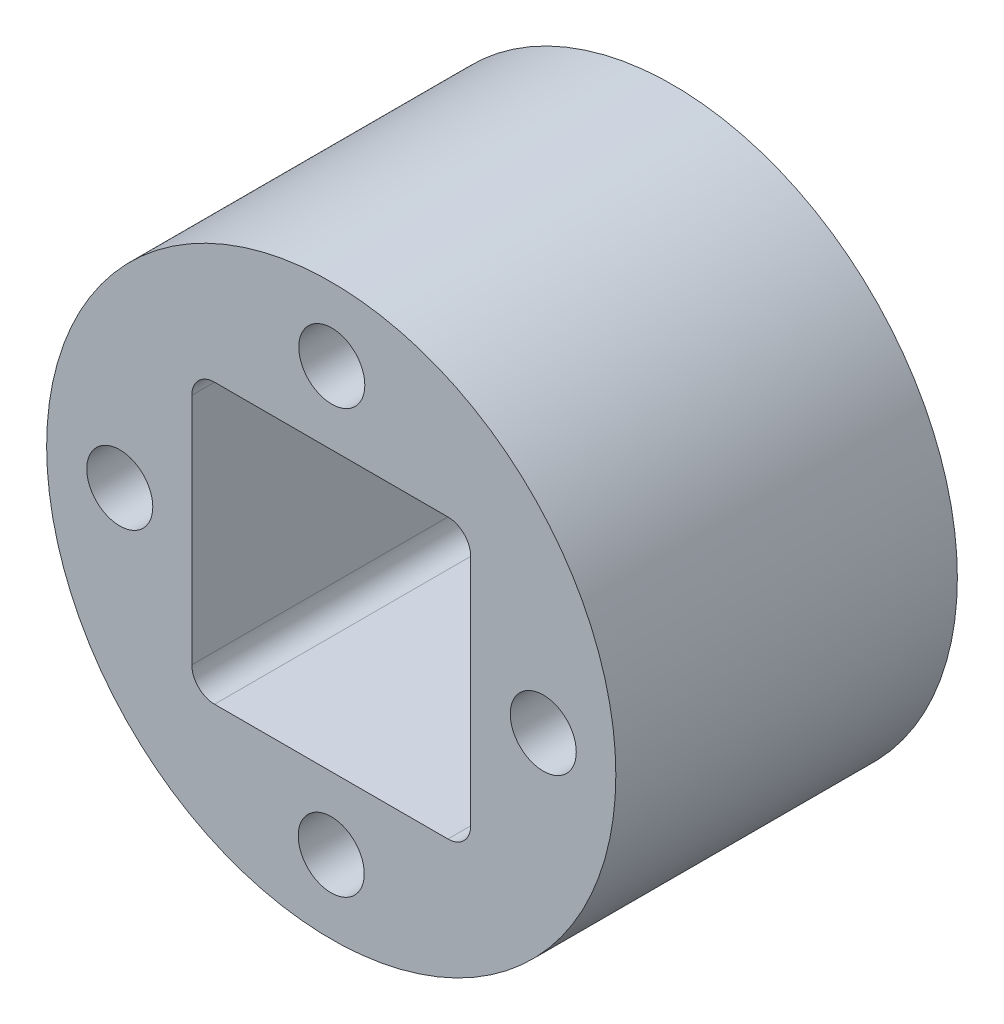
ISO-10303-21;
HEADER;
FILE_DESCRIPTION(('STEP AP214'),'2;1');
FILE_NAME('part.step','',(''),(''),'','','');
FILE_SCHEMA(('AUTOMOTIVE_DESIGN { 1 0 10303 214 1 1 1 1 }'));
ENDSEC;
DATA;
#1=APPLICATION_CONTEXT('core data for automotive mechanical design processes');
#2=APPLICATION_PROTOCOL_DEFINITION('international standard','automotive_design',2000,#1);
#3=PRODUCT_CONTEXT('',#1,'mechanical');
#4=PRODUCT('Part','Part','',(#3));
#5=PRODUCT_RELATED_PRODUCT_CATEGORY('part','',(#4));
#6=PRODUCT_DEFINITION_FORMATION('','',#4);
#7=PRODUCT_DEFINITION_CONTEXT('part definition',#1,'design');
#8=PRODUCT_DEFINITION('design','',#6,#7);
#9=PRODUCT_DEFINITION_SHAPE('','',#8);
#10=(LENGTH_UNIT() NAMED_UNIT(*) SI_UNIT(.MILLI.,.METRE.));
#11=(NAMED_UNIT(*) PLANE_ANGLE_UNIT() SI_UNIT($,.RADIAN.));
#12=(NAMED_UNIT(*) SI_UNIT($,.STERADIAN.) SOLID_ANGLE_UNIT());
#13=UNCERTAINTY_MEASURE_WITH_UNIT(LENGTH_MEASURE(1.E-05),#10,'distance_accuracy_value','');
#14=(GEOMETRIC_REPRESENTATION_CONTEXT(3) GLOBAL_UNCERTAINTY_ASSIGNED_CONTEXT((#13)) GLOBAL_UNIT_ASSIGNED_CONTEXT((#10,
#11,#12)) REPRESENTATION_CONTEXT('',''));
#15=CARTESIAN_POINT('',(0.,0.,0.));
#16=DIRECTION('',(0.,0.,1.));
#17=DIRECTION('',(1.,0.,0.));
#18=AXIS2_PLACEMENT_3D('',#15,#16,#17);
#19=CARTESIAN_POINT('',(0.,0.,7.5));
#20=DIRECTION('',(0.,0.,-1.));
#21=DIRECTION('',(-1.,0.,0.));
#22=AXIS2_PLACEMENT_3D('',#19,#20,#21);
#23=CYLINDRICAL_SURFACE('',#22,12.5);
#24=CARTESIAN_POINT('',(0.,0.,7.5));
#25=DIRECTION('',(0.,0.,1.));
#26=DIRECTION('',(1.,0.,0.));
#27=AXIS2_PLACEMENT_3D('',#24,#25,#26);
#28=CIRCLE('',#27,12.5);
#29=CARTESIAN_POINT('',(12.5,0.,7.5));
#30=VERTEX_POINT('',#29);
#31=EDGE_CURVE('E112',#30,#30,#28,.T.);
#32=ORIENTED_EDGE('',*,*,#31,.F.);
#33=EDGE_LOOP('',(#32));
#34=FACE_BOUND('',#33,.T.);
#35=CARTESIAN_POINT('',(0.,0.,-7.5));
#36=DIRECTION('',(0.,0.,1.));
#37=DIRECTION('',(1.,0.,0.));
#38=AXIS2_PLACEMENT_3D('',#35,#36,#37);
#39=CIRCLE('',#38,12.5);
#40=CARTESIAN_POINT('',(12.5,0.,-7.5));
#41=VERTEX_POINT('',#40);
#42=EDGE_CURVE('E151',#41,#41,#39,.T.);
#43=ORIENTED_EDGE('',*,*,#42,.T.);
#44=EDGE_LOOP('',(#43));
#45=FACE_BOUND('',#44,.T.);
#46=ADVANCED_FACE('F37',(#34,#45),#23,.T.);
#47=CARTESIAN_POINT('',(0.,0.,7.5));
#48=DIRECTION('',(0.,0.,1.));
#49=DIRECTION('',(1.,0.,0.));
#50=AXIS2_PLACEMENT_3D('',#47,#48,#49);
#51=PLANE('',#50);
#52=CARTESIAN_POINT('',(9.3125,0.,7.5));
#53=DIRECTION('',(0.,0.,1.));
#54=DIRECTION('',(1.,0.,0.));
#55=AXIS2_PLACEMENT_3D('',#52,#53,#54);
#56=CIRCLE('',#55,1.45);
#57=CARTESIAN_POINT('',(10.7625,0.,7.5));
#58=VERTEX_POINT('',#57);
#59=EDGE_CURVE('E202',#58,#58,#56,.T.);
#60=ORIENTED_EDGE('',*,*,#59,.F.);
#61=EDGE_LOOP('',(#60));
#62=FACE_BOUND('',#61,.T.);
#63=CARTESIAN_POINT('',(0.,-9.2875,7.5));
#64=DIRECTION('',(0.,0.,1.));
#65=DIRECTION('',(1.,0.,0.));
#66=AXIS2_PLACEMENT_3D('',#63,#64,#65);
#67=CIRCLE('',#66,1.45);
#68=CARTESIAN_POINT('',(1.45,-9.2875,7.5));
#69=VERTEX_POINT('',#68);
#70=EDGE_CURVE('E196',#69,#69,#67,.T.);
#71=ORIENTED_EDGE('',*,*,#70,.F.);
#72=EDGE_LOOP('',(#71));
#73=FACE_BOUND('',#72,.T.);
#74=CARTESIAN_POINT('',(-9.2875,0.0249999999999996,7.5));
#75=DIRECTION('',(0.,0.,1.));
#76=DIRECTION('',(1.,0.,0.));
#77=AXIS2_PLACEMENT_3D('',#74,#75,#76);
#78=CIRCLE('',#77,1.45);
#79=CARTESIAN_POINT('',(-7.8375,0.0249999999999996,7.5));
#80=VERTEX_POINT('',#79);
#81=EDGE_CURVE('E190',#80,#80,#78,.T.);
#82=ORIENTED_EDGE('',*,*,#81,.F.);
#83=EDGE_LOOP('',(#82));
#84=FACE_BOUND('',#83,.T.);
#85=CARTESIAN_POINT('',(0.0250000000000016,9.3125,7.5));
#86=DIRECTION('',(0.,0.,1.));
#87=DIRECTION('',(1.,0.,0.));
#88=AXIS2_PLACEMENT_3D('',#85,#86,#87);
#89=CIRCLE('',#88,1.45);
#90=CARTESIAN_POINT('',(1.475,9.3125,7.5));
#91=VERTEX_POINT('',#90);
#92=EDGE_CURVE('E184',#91,#91,#89,.T.);
#93=ORIENTED_EDGE('',*,*,#92,.F.);
#94=EDGE_LOOP('',(#93));
#95=FACE_BOUND('',#94,.T.);
#96=DIRECTION('',(0.,1.,0.));
#97=VECTOR('',#96,1.);
#98=CARTESIAN_POINT('',(6.125,6.125,7.5));
#99=LINE('',#98,#97);
#100=CARTESIAN_POINT('',(6.125,-5.125,7.5));
#101=VERTEX_POINT('',#100);
#102=CARTESIAN_POINT('',(6.125,5.125,7.5));
#103=VERTEX_POINT('',#102);
#104=EDGE_CURVE('E172',#101,#103,#99,.T.);
#105=ORIENTED_EDGE('',*,*,#104,.F.);
#106=CARTESIAN_POINT('',(5.125,-5.125,7.5));
#107=DIRECTION('',(0.,0.,1.));
#108=DIRECTION('',(1.,0.,0.));
#109=AXIS2_PLACEMENT_3D('',#106,#107,#108);
#110=CIRCLE('',#109,1.);
#111=CARTESIAN_POINT('',(5.125,-6.125,7.5));
#112=VERTEX_POINT('',#111);
#113=EDGE_CURVE('E52',#101,#112,#110,.F.);
#114=ORIENTED_EDGE('',*,*,#113,.T.);
#115=DIRECTION('',(1.,0.,0.));
#116=VECTOR('',#115,1.);
#117=CARTESIAN_POINT('',(-6.125,-6.125,7.5));
#118=LINE('',#117,#116);
#119=CARTESIAN_POINT('',(-5.125,-6.125,7.5));
#120=VERTEX_POINT('',#119);
#121=EDGE_CURVE('E146',#120,#112,#118,.T.);
#122=ORIENTED_EDGE('',*,*,#121,.F.);
#123=CARTESIAN_POINT('',(-5.125,-5.125,7.5));
#124=DIRECTION('',(0.,0.,1.));
#125=DIRECTION('',(1.,0.,0.));
#126=AXIS2_PLACEMENT_3D('',#123,#124,#125);
#127=CIRCLE('',#126,1.);
#128=CARTESIAN_POINT('',(-6.125,-5.125,7.5));
#129=VERTEX_POINT('',#128);
#130=EDGE_CURVE('E45',#120,#129,#127,.F.);
#131=ORIENTED_EDGE('',*,*,#130,.T.);
#132=DIRECTION('',(0.,-1.,0.));
#133=VECTOR('',#132,1.);
#134=CARTESIAN_POINT('',(-6.125,6.125,7.5));
#135=LINE('',#134,#133);
#136=CARTESIAN_POINT('',(-6.125,5.125,7.5));
#137=VERTEX_POINT('',#136);
#138=EDGE_CURVE('E109',#137,#129,#135,.T.);
#139=ORIENTED_EDGE('',*,*,#138,.F.);
#140=CARTESIAN_POINT('',(-5.125,5.125,7.5));
#141=DIRECTION('',(0.,0.,1.));
#142=DIRECTION('',(1.,0.,0.));
#143=AXIS2_PLACEMENT_3D('',#140,#141,#142);
#144=CIRCLE('',#143,1.);
#145=CARTESIAN_POINT('',(-5.125,6.125,7.5));
#146=VERTEX_POINT('',#145);
#147=EDGE_CURVE('E130',#137,#146,#144,.F.);
#148=ORIENTED_EDGE('',*,*,#147,.T.);
#149=DIRECTION('',(-1.,0.,0.));
#150=VECTOR('',#149,1.);
#151=CARTESIAN_POINT('',(-6.125,6.125,7.5));
#152=LINE('',#151,#150);
#153=CARTESIAN_POINT('',(5.125,6.125,7.5));
#154=VERTEX_POINT('',#153);
#155=EDGE_CURVE('E153',#154,#146,#152,.T.);
#156=ORIENTED_EDGE('',*,*,#155,.F.);
#157=CARTESIAN_POINT('',(5.125,5.125,7.5));
#158=DIRECTION('',(0.,0.,1.));
#159=DIRECTION('',(1.,0.,0.));
#160=AXIS2_PLACEMENT_3D('',#157,#158,#159);
#161=CIRCLE('',#160,1.);
#162=EDGE_CURVE('E138',#154,#103,#161,.F.);
#163=ORIENTED_EDGE('',*,*,#162,.T.);
#164=EDGE_LOOP('',(#105,#114,#122,#131,#139,#148,#156,#163));
#165=FACE_BOUND('',#164,.T.);
#166=ORIENTED_EDGE('',*,*,#31,.T.);
#167=EDGE_LOOP('',(#166));
#168=FACE_BOUND('',#167,.T.);
#169=ADVANCED_FACE('F144',(#62,#73,#84,#95,#165,#168),#51,.T.);
#170=CARTESIAN_POINT('',(0.,0.,-7.5));
#171=DIRECTION('',(0.,0.,1.));
#172=DIRECTION('',(1.,0.,0.));
#173=AXIS2_PLACEMENT_3D('',#170,#171,#172);
#174=PLANE('',#173);
#175=DIRECTION('',(-1.,0.,0.));
#176=VECTOR('',#175,1.);
#177=CARTESIAN_POINT('',(-6.125,-6.125,-7.5));
#178=LINE('',#177,#176);
#179=CARTESIAN_POINT('',(5.125,-6.125,-7.5));
#180=VERTEX_POINT('',#179);
#181=CARTESIAN_POINT('',(-5.125,-6.125,-7.5));
#182=VERTEX_POINT('',#181);
#183=EDGE_CURVE('E122',#180,#182,#178,.T.);
#184=ORIENTED_EDGE('',*,*,#183,.F.);
#185=CARTESIAN_POINT('',(5.125,-5.125,-7.5));
#186=DIRECTION('',(0.,0.,1.));
#187=DIRECTION('',(1.,0.,0.));
#188=AXIS2_PLACEMENT_3D('',#185,#186,#187);
#189=CIRCLE('',#188,1.);
#190=CARTESIAN_POINT('',(6.125,-5.125,-7.5));
#191=VERTEX_POINT('',#190);
#192=EDGE_CURVE('E143',#180,#191,#189,.T.);
#193=ORIENTED_EDGE('',*,*,#192,.T.);
#194=DIRECTION('',(0.,-1.,0.));
#195=VECTOR('',#194,1.);
#196=CARTESIAN_POINT('',(6.125,6.125,-7.5));
#197=LINE('',#196,#195);
#198=CARTESIAN_POINT('',(6.125,5.125,-7.5));
#199=VERTEX_POINT('',#198);
#200=EDGE_CURVE('E175',#199,#191,#197,.T.);
#201=ORIENTED_EDGE('',*,*,#200,.F.);
#202=CARTESIAN_POINT('',(5.125,5.125,-7.5));
#203=DIRECTION('',(0.,0.,1.));
#204=DIRECTION('',(1.,0.,0.));
#205=AXIS2_PLACEMENT_3D('',#202,#203,#204);
#206=CIRCLE('',#205,1.);
#207=CARTESIAN_POINT('',(5.125,6.125,-7.5));
#208=VERTEX_POINT('',#207);
#209=EDGE_CURVE('E140',#199,#208,#206,.T.);
#210=ORIENTED_EDGE('',*,*,#209,.T.);
#211=DIRECTION('',(1.,0.,0.));
#212=VECTOR('',#211,1.);
#213=CARTESIAN_POINT('',(-6.125,6.125,-7.5));
#214=LINE('',#213,#212);
#215=CARTESIAN_POINT('',(-5.125,6.125,-7.5));
#216=VERTEX_POINT('',#215);
#217=EDGE_CURVE('E148',#216,#208,#214,.T.);
#218=ORIENTED_EDGE('',*,*,#217,.F.);
#219=CARTESIAN_POINT('',(-5.125,5.125,-7.5));
#220=DIRECTION('',(0.,0.,1.));
#221=DIRECTION('',(1.,0.,0.));
#222=AXIS2_PLACEMENT_3D('',#219,#220,#221);
#223=CIRCLE('',#222,1.);
#224=CARTESIAN_POINT('',(-6.125,5.125,-7.5));
#225=VERTEX_POINT('',#224);
#226=EDGE_CURVE('E121',#216,#225,#223,.T.);
#227=ORIENTED_EDGE('',*,*,#226,.T.);
#228=DIRECTION('',(0.,1.,0.));
#229=VECTOR('',#228,1.);
#230=CARTESIAN_POINT('',(-6.125,6.125,-7.5));
#231=LINE('',#230,#229);
#232=CARTESIAN_POINT('',(-6.125,-5.125,-7.5));
#233=VERTEX_POINT('',#232);
#234=EDGE_CURVE('E106',#233,#225,#231,.T.);
#235=ORIENTED_EDGE('',*,*,#234,.F.);
#236=CARTESIAN_POINT('',(-5.125,-5.125,-7.5));
#237=DIRECTION('',(0.,0.,1.));
#238=DIRECTION('',(1.,0.,0.));
#239=AXIS2_PLACEMENT_3D('',#236,#237,#238);
#240=CIRCLE('',#239,1.);
#241=EDGE_CURVE('E11',#233,#182,#240,.T.);
#242=ORIENTED_EDGE('',*,*,#241,.T.);
#243=EDGE_LOOP('',(#184,#193,#201,#210,#218,#227,#235,#242));
#244=FACE_BOUND('',#243,.T.);
#245=ORIENTED_EDGE('',*,*,#42,.F.);
#246=EDGE_LOOP('',(#245));
#247=FACE_BOUND('',#246,.T.);
#248=ADVANCED_FACE('F116',(#244,#247),#174,.F.);
#249=CARTESIAN_POINT('',(6.125,6.125,-7.501));
#250=DIRECTION('',(1.,0.,0.));
#251=DIRECTION('',(0.,1.,0.));
#252=AXIS2_PLACEMENT_3D('',#249,#250,#251);
#253=PLANE('',#252);
#254=ORIENTED_EDGE('',*,*,#104,.T.);
#255=DIRECTION('',(0.,0.,1.));
#256=VECTOR('',#255,1.);
#257=CARTESIAN_POINT('',(6.125,5.125,-7.5));
#258=LINE('',#257,#256);
#259=EDGE_CURVE('E128',#103,#199,#258,.F.);
#260=ORIENTED_EDGE('',*,*,#259,.T.);
#261=ORIENTED_EDGE('',*,*,#200,.T.);
#262=DIRECTION('',(0.,0.,1.));
#263=VECTOR('',#262,1.);
#264=CARTESIAN_POINT('',(6.125,-5.125,7.5));
#265=LINE('',#264,#263);
#266=EDGE_CURVE('E132',#191,#101,#265,.T.);
#267=ORIENTED_EDGE('',*,*,#266,.T.);
#268=EDGE_LOOP('',(#254,#260,#261,#267));
#269=FACE_BOUND('',#268,.T.);
#270=ADVANCED_FACE('F171',(#269),#253,.F.);
#271=CARTESIAN_POINT('',(-6.125,-6.125,-7.501));
#272=DIRECTION('',(0.,-1.,0.));
#273=DIRECTION('',(0.,0.,-1.));
#274=AXIS2_PLACEMENT_3D('',#271,#272,#273);
#275=PLANE('',#274);
#276=ORIENTED_EDGE('',*,*,#121,.T.);
#277=DIRECTION('',(0.,0.,1.));
#278=VECTOR('',#277,1.);
#279=CARTESIAN_POINT('',(5.125,-6.125,-7.5));
#280=LINE('',#279,#278);
#281=EDGE_CURVE('E127',#112,#180,#280,.F.);
#282=ORIENTED_EDGE('',*,*,#281,.T.);
#283=ORIENTED_EDGE('',*,*,#183,.T.);
#284=DIRECTION('',(0.,0.,1.));
#285=VECTOR('',#284,1.);
#286=CARTESIAN_POINT('',(-5.125,-6.125,7.5));
#287=LINE('',#286,#285);
#288=EDGE_CURVE('E125',#182,#120,#287,.T.);
#289=ORIENTED_EDGE('',*,*,#288,.T.);
#290=EDGE_LOOP('',(#276,#282,#283,#289));
#291=FACE_BOUND('',#290,.T.);
#292=ADVANCED_FACE('F265',(#291),#275,.F.);
#293=CARTESIAN_POINT('',(-6.125,6.125,-7.501));
#294=DIRECTION('',(-1.,0.,0.));
#295=DIRECTION('',(0.,-1.,0.));
#296=AXIS2_PLACEMENT_3D('',#293,#294,#295);
#297=PLANE('',#296);
#298=ORIENTED_EDGE('',*,*,#234,.T.);
#299=DIRECTION('',(0.,0.,1.));
#300=VECTOR('',#299,1.);
#301=CARTESIAN_POINT('',(-6.125,5.125,7.5));
#302=LINE('',#301,#300);
#303=EDGE_CURVE('E111',#225,#137,#302,.T.);
#304=ORIENTED_EDGE('',*,*,#303,.T.);
#305=ORIENTED_EDGE('',*,*,#138,.T.);
#306=DIRECTION('',(0.,0.,1.));
#307=VECTOR('',#306,1.);
#308=CARTESIAN_POINT('',(-6.125,-5.125,-7.5));
#309=LINE('',#308,#307);
#310=EDGE_CURVE('E102',#129,#233,#309,.F.);
#311=ORIENTED_EDGE('',*,*,#310,.T.);
#312=EDGE_LOOP('',(#298,#304,#305,#311));
#313=FACE_BOUND('',#312,.T.);
#314=ADVANCED_FACE('F104',(#313),#297,.F.);
#315=CARTESIAN_POINT('',(-6.125,6.125,-7.501));
#316=DIRECTION('',(0.,1.,0.));
#317=DIRECTION('',(0.,0.,1.));
#318=AXIS2_PLACEMENT_3D('',#315,#316,#317);
#319=PLANE('',#318);
#320=ORIENTED_EDGE('',*,*,#155,.T.);
#321=DIRECTION('',(0.,0.,1.));
#322=VECTOR('',#321,1.);
#323=CARTESIAN_POINT('',(-5.125,6.125,-7.5));
#324=LINE('',#323,#322);
#325=EDGE_CURVE('E165',#146,#216,#324,.F.);
#326=ORIENTED_EDGE('',*,*,#325,.T.);
#327=ORIENTED_EDGE('',*,*,#217,.T.);
#328=DIRECTION('',(0.,0.,1.));
#329=VECTOR('',#328,1.);
#330=CARTESIAN_POINT('',(5.125,6.125,7.5));
#331=LINE('',#330,#329);
#332=EDGE_CURVE('E162',#208,#154,#331,.T.);
#333=ORIENTED_EDGE('',*,*,#332,.T.);
#334=EDGE_LOOP('',(#320,#326,#327,#333));
#335=FACE_BOUND('',#334,.T.);
#336=ADVANCED_FACE('F229',(#335),#319,.F.);
#337=CARTESIAN_POINT('',(0.0250000000000016,9.3125,-2.5));
#338=DIRECTION('',(0.,0.,1.));
#339=DIRECTION('',(1.,0.,0.));
#340=AXIS2_PLACEMENT_3D('',#337,#338,#339);
#341=CYLINDRICAL_SURFACE('',#340,1.45);
#342=CARTESIAN_POINT('',(0.0250000000000016,9.3125,-2.5));
#343=DIRECTION('',(0.,0.,1.));
#344=DIRECTION('',(1.,0.,0.));
#345=AXIS2_PLACEMENT_3D('',#342,#343,#344);
#346=CIRCLE('',#345,1.45);
#347=CARTESIAN_POINT('',(1.475,9.3125,-2.5));
#348=VERTEX_POINT('',#347);
#349=EDGE_CURVE('E187',#348,#348,#346,.T.);
#350=ORIENTED_EDGE('',*,*,#349,.F.);
#351=EDGE_LOOP('',(#350));
#352=FACE_BOUND('',#351,.T.);
#353=ORIENTED_EDGE('',*,*,#92,.T.);
#354=EDGE_LOOP('',(#353));
#355=FACE_BOUND('',#354,.T.);
#356=ADVANCED_FACE('F226',(#352,#355),#341,.F.);
#357=CARTESIAN_POINT('',(0.0250000000000016,9.3125,-2.5));
#358=DIRECTION('',(0.,0.,1.));
#359=DIRECTION('',(1.,0.,0.));
#360=AXIS2_PLACEMENT_3D('',#357,#358,#359);
#361=PLANE('',#360);
#362=ORIENTED_EDGE('',*,*,#349,.T.);
#363=EDGE_LOOP('',(#362));
#364=FACE_BOUND('',#363,.T.);
#365=ADVANCED_FACE('F228',(#364),#361,.T.);
#366=CARTESIAN_POINT('',(-9.2875,0.0249999999999996,-2.5));
#367=DIRECTION('',(0.,0.,1.));
#368=DIRECTION('',(1.,0.,0.));
#369=AXIS2_PLACEMENT_3D('',#366,#367,#368);
#370=CYLINDRICAL_SURFACE('',#369,1.45);
#371=CARTESIAN_POINT('',(-9.2875,0.0249999999999996,-2.5));
#372=DIRECTION('',(0.,0.,1.));
#373=DIRECTION('',(1.,0.,0.));
#374=AXIS2_PLACEMENT_3D('',#371,#372,#373);
#375=CIRCLE('',#374,1.45);
#376=CARTESIAN_POINT('',(-7.8375,0.0249999999999996,-2.5));
#377=VERTEX_POINT('',#376);
#378=EDGE_CURVE('E193',#377,#377,#375,.T.);
#379=ORIENTED_EDGE('',*,*,#378,.F.);
#380=EDGE_LOOP('',(#379));
#381=FACE_BOUND('',#380,.T.);
#382=ORIENTED_EDGE('',*,*,#81,.T.);
#383=EDGE_LOOP('',(#382));
#384=FACE_BOUND('',#383,.T.);
#385=ADVANCED_FACE('F236',(#381,#384),#370,.F.);
#386=CARTESIAN_POINT('',(-9.2875,0.0249999999999996,-2.5));
#387=DIRECTION('',(0.,0.,1.));
#388=DIRECTION('',(1.,0.,0.));
#389=AXIS2_PLACEMENT_3D('',#386,#387,#388);
#390=PLANE('',#389);
#391=ORIENTED_EDGE('',*,*,#378,.T.);
#392=EDGE_LOOP('',(#391));
#393=FACE_BOUND('',#392,.T.);
#394=ADVANCED_FACE('F317',(#393),#390,.T.);
#395=CARTESIAN_POINT('',(0.,-9.2875,-2.5));
#396=DIRECTION('',(0.,0.,1.));
#397=DIRECTION('',(1.,0.,0.));
#398=AXIS2_PLACEMENT_3D('',#395,#396,#397);
#399=CYLINDRICAL_SURFACE('',#398,1.45);
#400=CARTESIAN_POINT('',(0.,-9.2875,-2.5));
#401=DIRECTION('',(0.,0.,1.));
#402=DIRECTION('',(1.,0.,0.));
#403=AXIS2_PLACEMENT_3D('',#400,#401,#402);
#404=CIRCLE('',#403,1.45);
#405=CARTESIAN_POINT('',(1.45,-9.2875,-2.5));
#406=VERTEX_POINT('',#405);
#407=EDGE_CURVE('E199',#406,#406,#404,.T.);
#408=ORIENTED_EDGE('',*,*,#407,.F.);
#409=EDGE_LOOP('',(#408));
#410=FACE_BOUND('',#409,.T.);
#411=ORIENTED_EDGE('',*,*,#70,.T.);
#412=EDGE_LOOP('',(#411));
#413=FACE_BOUND('',#412,.T.);
#414=ADVANCED_FACE('F307',(#410,#413),#399,.F.);
#415=CARTESIAN_POINT('',(0.,-9.2875,-2.5));
#416=DIRECTION('',(0.,0.,1.));
#417=DIRECTION('',(1.,0.,0.));
#418=AXIS2_PLACEMENT_3D('',#415,#416,#417);
#419=PLANE('',#418);
#420=ORIENTED_EDGE('',*,*,#407,.T.);
#421=EDGE_LOOP('',(#420));
#422=FACE_BOUND('',#421,.T.);
#423=ADVANCED_FACE('F213',(#422),#419,.T.);
#424=CARTESIAN_POINT('',(9.3125,0.,-2.5));
#425=DIRECTION('',(0.,0.,1.));
#426=DIRECTION('',(1.,0.,0.));
#427=AXIS2_PLACEMENT_3D('',#424,#425,#426);
#428=CYLINDRICAL_SURFACE('',#427,1.45);
#429=CARTESIAN_POINT('',(9.3125,0.,-2.5));
#430=DIRECTION('',(0.,0.,1.));
#431=DIRECTION('',(1.,0.,0.));
#432=AXIS2_PLACEMENT_3D('',#429,#430,#431);
#433=CIRCLE('',#432,1.45);
#434=CARTESIAN_POINT('',(10.7625,0.,-2.5));
#435=VERTEX_POINT('',#434);
#436=EDGE_CURVE('E123',#435,#435,#433,.T.);
#437=ORIENTED_EDGE('',*,*,#436,.F.);
#438=EDGE_LOOP('',(#437));
#439=FACE_BOUND('',#438,.T.);
#440=ORIENTED_EDGE('',*,*,#59,.T.);
#441=EDGE_LOOP('',(#440));
#442=FACE_BOUND('',#441,.T.);
#443=ADVANCED_FACE('F210',(#439,#442),#428,.F.);
#444=CARTESIAN_POINT('',(9.3125,0.,-2.5));
#445=DIRECTION('',(0.,0.,1.));
#446=DIRECTION('',(1.,0.,0.));
#447=AXIS2_PLACEMENT_3D('',#444,#445,#446);
#448=PLANE('',#447);
#449=ORIENTED_EDGE('',*,*,#436,.T.);
#450=EDGE_LOOP('',(#449));
#451=FACE_BOUND('',#450,.T.);
#452=ADVANCED_FACE('F208',(#451),#448,.T.);
#453=CARTESIAN_POINT('',(-5.125,5.125,-7.501));
#454=DIRECTION('',(0.,0.,-1.));
#455=DIRECTION('',(-1.,0.,0.));
#456=AXIS2_PLACEMENT_3D('',#453,#454,#455);
#457=CYLINDRICAL_SURFACE('',#456,1.);
#458=ORIENTED_EDGE('',*,*,#226,.F.);
#459=ORIENTED_EDGE('',*,*,#325,.F.);
#460=ORIENTED_EDGE('',*,*,#147,.F.);
#461=ORIENTED_EDGE('',*,*,#303,.F.);
#462=EDGE_LOOP('',(#458,#459,#460,#461));
#463=FACE_BOUND('',#462,.T.);
#464=ADVANCED_FACE('F252',(#463),#457,.F.);
#465=CARTESIAN_POINT('',(5.125,5.125,-7.501));
#466=DIRECTION('',(0.,0.,-1.));
#467=DIRECTION('',(-1.,0.,0.));
#468=AXIS2_PLACEMENT_3D('',#465,#466,#467);
#469=CYLINDRICAL_SURFACE('',#468,1.);
#470=ORIENTED_EDGE('',*,*,#209,.F.);
#471=ORIENTED_EDGE('',*,*,#259,.F.);
#472=ORIENTED_EDGE('',*,*,#162,.F.);
#473=ORIENTED_EDGE('',*,*,#332,.F.);
#474=EDGE_LOOP('',(#470,#471,#472,#473));
#475=FACE_BOUND('',#474,.T.);
#476=ADVANCED_FACE('F255',(#475),#469,.F.);
#477=CARTESIAN_POINT('',(5.125,-5.125,-7.501));
#478=DIRECTION('',(0.,0.,-1.));
#479=DIRECTION('',(-1.,0.,0.));
#480=AXIS2_PLACEMENT_3D('',#477,#478,#479);
#481=CYLINDRICAL_SURFACE('',#480,1.);
#482=ORIENTED_EDGE('',*,*,#192,.F.);
#483=ORIENTED_EDGE('',*,*,#281,.F.);
#484=ORIENTED_EDGE('',*,*,#113,.F.);
#485=ORIENTED_EDGE('',*,*,#266,.F.);
#486=EDGE_LOOP('',(#482,#483,#484,#485));
#487=FACE_BOUND('',#486,.T.);
#488=ADVANCED_FACE('F258',(#487),#481,.F.);
#489=CARTESIAN_POINT('',(-5.125,-5.125,-7.501));
#490=DIRECTION('',(0.,0.,-1.));
#491=DIRECTION('',(-1.,0.,0.));
#492=AXIS2_PLACEMENT_3D('',#489,#490,#491);
#493=CYLINDRICAL_SURFACE('',#492,1.);
#494=ORIENTED_EDGE('',*,*,#241,.F.);
#495=ORIENTED_EDGE('',*,*,#310,.F.);
#496=ORIENTED_EDGE('',*,*,#130,.F.);
#497=ORIENTED_EDGE('',*,*,#288,.F.);
#498=EDGE_LOOP('',(#494,#495,#496,#497));
#499=FACE_BOUND('',#498,.T.);
#500=ADVANCED_FACE('F39',(#499),#493,.F.);
#501=CLOSED_SHELL('',(#46,#169,#248,#270,#292,#314,#336,#356,#365,#385,#394,#414,#423,#443,#452,
#464,#476,#488,#500));
#502=MANIFOLD_SOLID_BREP('B2',#501);
#503=ADVANCED_BREP_SHAPE_REPRESENTATION('',(#18,#502),#14);
#504=SHAPE_DEFINITION_REPRESENTATION(#9,#503);
ENDSEC;
END-ISO-10303-21;
